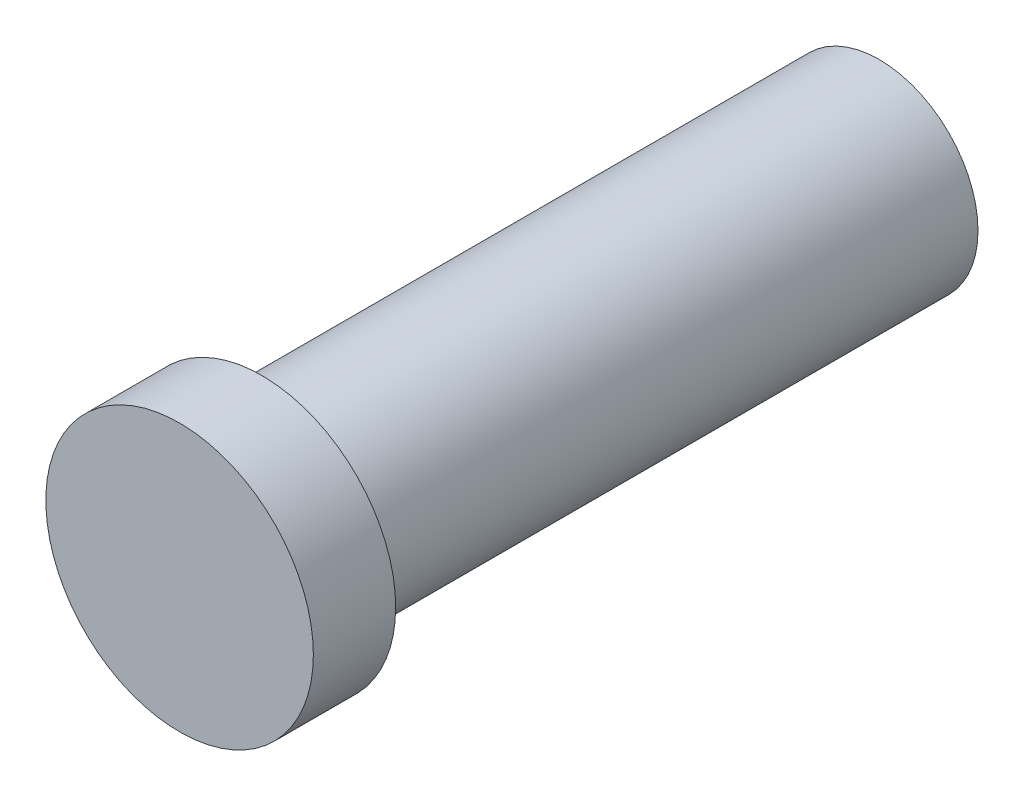
ISO-10303-21;
HEADER;
FILE_DESCRIPTION(('STEP AP214'),'2;1');
FILE_NAME('part.step','',(''),(''),'','','');
FILE_SCHEMA(('AUTOMOTIVE_DESIGN { 1 0 10303 214 1 1 1 1 }'));
ENDSEC;
DATA;
#1=APPLICATION_CONTEXT('core data for automotive mechanical design processes');
#2=APPLICATION_PROTOCOL_DEFINITION('international standard','automotive_design',2000,#1);
#3=PRODUCT_CONTEXT('',#1,'mechanical');
#4=PRODUCT('Part','Part','',(#3));
#5=PRODUCT_RELATED_PRODUCT_CATEGORY('part','',(#4));
#6=PRODUCT_DEFINITION_FORMATION('','',#4);
#7=PRODUCT_DEFINITION_CONTEXT('part definition',#1,'design');
#8=PRODUCT_DEFINITION('design','',#6,#7);
#9=PRODUCT_DEFINITION_SHAPE('','',#8);
#10=(LENGTH_UNIT() NAMED_UNIT(*) SI_UNIT(.MILLI.,.METRE.));
#11=(NAMED_UNIT(*) PLANE_ANGLE_UNIT() SI_UNIT($,.RADIAN.));
#12=(NAMED_UNIT(*) SI_UNIT($,.STERADIAN.) SOLID_ANGLE_UNIT());
#13=UNCERTAINTY_MEASURE_WITH_UNIT(LENGTH_MEASURE(1.E-05),#10,'distance_accuracy_value','');
#14=(GEOMETRIC_REPRESENTATION_CONTEXT(3) GLOBAL_UNCERTAINTY_ASSIGNED_CONTEXT((#13)) GLOBAL_UNIT_ASSIGNED_CONTEXT((#10,
#11,#12)) REPRESENTATION_CONTEXT('',''));
#15=CARTESIAN_POINT('',(0.,0.,0.));
#16=DIRECTION('',(0.,0.,1.));
#17=DIRECTION('',(1.,0.,0.));
#18=AXIS2_PLACEMENT_3D('',#15,#16,#17);
#19=CARTESIAN_POINT('',(0.,0.,30.));
#20=DIRECTION('',(0.,0.,-1.));
#21=DIRECTION('',(-1.,0.,0.));
#22=AXIS2_PLACEMENT_3D('',#19,#20,#21);
#23=CYLINDRICAL_SURFACE('',#22,4.8);
#24=CARTESIAN_POINT('',(0.,0.,30.));
#25=DIRECTION('',(0.,0.,1.));
#26=DIRECTION('',(1.,0.,0.));
#27=AXIS2_PLACEMENT_3D('',#24,#25,#26);
#28=CIRCLE('',#27,4.8);
#29=CARTESIAN_POINT('',(4.8,0.,30.));
#30=VERTEX_POINT('',#29);
#31=EDGE_CURVE('E10',#30,#30,#28,.T.);
#32=ORIENTED_EDGE('',*,*,#31,.F.);
#33=EDGE_LOOP('',(#32));
#34=FACE_BOUND('',#33,.T.);
#35=CARTESIAN_POINT('',(0.,0.,0.));
#36=DIRECTION('',(0.,0.,1.));
#37=DIRECTION('',(1.,0.,0.));
#38=AXIS2_PLACEMENT_3D('',#35,#36,#37);
#39=CIRCLE('',#38,4.8);
#40=CARTESIAN_POINT('',(4.8,0.,0.));
#41=VERTEX_POINT('',#40);
#42=EDGE_CURVE('E34',#41,#41,#39,.T.);
#43=ORIENTED_EDGE('',*,*,#42,.T.);
#44=EDGE_LOOP('',(#43));
#45=FACE_BOUND('',#44,.T.);
#46=ADVANCED_FACE('F31',(#34,#45),#23,.T.);
#47=CARTESIAN_POINT('',(0.,0.,0.));
#48=DIRECTION('',(0.,0.,1.));
#49=DIRECTION('',(1.,0.,0.));
#50=AXIS2_PLACEMENT_3D('',#47,#48,#49);
#51=PLANE('',#50);
#52=CARTESIAN_POINT('',(0.,0.,0.));
#53=DIRECTION('',(0.,0.,-1.));
#54=DIRECTION('',(-1.,0.,0.));
#55=AXIS2_PLACEMENT_3D('',#52,#53,#54);
#56=CIRCLE('',#55,3.5);
#57=CARTESIAN_POINT('',(-3.5,0.,0.));
#58=VERTEX_POINT('',#57);
#59=EDGE_CURVE('E51',#58,#58,#56,.T.);
#60=ORIENTED_EDGE('',*,*,#59,.F.);
#61=EDGE_LOOP('',(#60));
#62=FACE_BOUND('',#61,.T.);
#63=ORIENTED_EDGE('',*,*,#42,.F.);
#64=EDGE_LOOP('',(#63));
#65=FACE_BOUND('',#64,.T.);
#66=ADVANCED_FACE('F57',(#62,#65),#51,.F.);
#67=CARTESIAN_POINT('',(0.,0.,34.));
#68=DIRECTION('',(0.,0.,-1.));
#69=DIRECTION('',(-1.,0.,0.));
#70=AXIS2_PLACEMENT_3D('',#67,#68,#69);
#71=CYLINDRICAL_SURFACE('',#70,6.5);
#72=CARTESIAN_POINT('',(0.,0.,34.));
#73=DIRECTION('',(0.,0.,1.));
#74=DIRECTION('',(1.,0.,0.));
#75=AXIS2_PLACEMENT_3D('',#72,#73,#74);
#76=CIRCLE('',#75,6.5);
#77=CARTESIAN_POINT('',(6.5,0.,34.));
#78=VERTEX_POINT('',#77);
#79=EDGE_CURVE('E41',#78,#78,#76,.T.);
#80=ORIENTED_EDGE('',*,*,#79,.F.);
#81=EDGE_LOOP('',(#80));
#82=FACE_BOUND('',#81,.T.);
#83=CARTESIAN_POINT('',(0.,0.,30.));
#84=DIRECTION('',(0.,0.,1.));
#85=DIRECTION('',(1.,0.,0.));
#86=AXIS2_PLACEMENT_3D('',#83,#84,#85);
#87=CIRCLE('',#86,6.5);
#88=CARTESIAN_POINT('',(6.5,0.,30.));
#89=VERTEX_POINT('',#88);
#90=EDGE_CURVE('E43',#89,#89,#87,.T.);
#91=ORIENTED_EDGE('',*,*,#90,.T.);
#92=EDGE_LOOP('',(#91));
#93=FACE_BOUND('',#92,.T.);
#94=ADVANCED_FACE('F60',(#82,#93),#71,.T.);
#95=CARTESIAN_POINT('',(0.,0.,34.));
#96=DIRECTION('',(0.,0.,1.));
#97=DIRECTION('',(1.,0.,0.));
#98=AXIS2_PLACEMENT_3D('',#95,#96,#97);
#99=PLANE('',#98);
#100=ORIENTED_EDGE('',*,*,#79,.T.);
#101=EDGE_LOOP('',(#100));
#102=FACE_BOUND('',#101,.T.);
#103=ADVANCED_FACE('F79',(#102),#99,.T.);
#104=CARTESIAN_POINT('',(0.,0.,30.));
#105=DIRECTION('',(0.,0.,1.));
#106=DIRECTION('',(1.,0.,0.));
#107=AXIS2_PLACEMENT_3D('',#104,#105,#106);
#108=PLANE('',#107);
#109=ORIENTED_EDGE('',*,*,#31,.T.);
#110=EDGE_LOOP('',(#109));
#111=FACE_BOUND('',#110,.T.);
#112=ORIENTED_EDGE('',*,*,#90,.F.);
#113=EDGE_LOOP('',(#112));
#114=FACE_BOUND('',#113,.T.);
#115=ADVANCED_FACE('F87',(#111,#114),#108,.F.);
#116=CARTESIAN_POINT('',(0.,0.,0.));
#117=DIRECTION('',(0.,0.,-1.));
#118=DIRECTION('',(-1.,0.,0.));
#119=AXIS2_PLACEMENT_3D('',#116,#117,#118);
#120=CONICAL_SURFACE('',#119,3.5,0.10471975511966);
#121=CARTESIAN_POINT('',(0.,0.,15.));
#122=DIRECTION('',(0.,0.,-1.));
#123=DIRECTION('',(-1.,0.,0.));
#124=AXIS2_PLACEMENT_3D('',#121,#122,#123);
#125=CIRCLE('',#124,1.92343647101485);
#126=CARTESIAN_POINT('',(-1.92343647101485,0.,15.));
#127=VERTEX_POINT('',#126);
#128=EDGE_CURVE('E46',#127,#127,#125,.T.);
#129=ORIENTED_EDGE('',*,*,#128,.F.);
#130=EDGE_LOOP('',(#129));
#131=FACE_BOUND('',#130,.T.);
#132=ORIENTED_EDGE('',*,*,#59,.T.);
#133=EDGE_LOOP('',(#132));
#134=FACE_BOUND('',#133,.T.);
#135=ADVANCED_FACE('F55',(#131,#134),#120,.F.);
#136=CARTESIAN_POINT('',(0.,0.,15.));
#137=DIRECTION('',(0.,0.,-1.));
#138=DIRECTION('',(-1.,0.,0.));
#139=AXIS2_PLACEMENT_3D('',#136,#137,#138);
#140=PLANE('',#139);
#141=ORIENTED_EDGE('',*,*,#128,.T.);
#142=EDGE_LOOP('',(#141));
#143=FACE_BOUND('',#142,.T.);
#144=ADVANCED_FACE('F99',(#143),#140,.T.);
#145=CLOSED_SHELL('',(#46,#66,#94,#103,#115,#135,#144));
#146=MANIFOLD_SOLID_BREP('B2',#145);
#147=ADVANCED_BREP_SHAPE_REPRESENTATION('',(#18,#146),#14);
#148=SHAPE_DEFINITION_REPRESENTATION(#9,#147);
ENDSEC;
END-ISO-10303-21;
